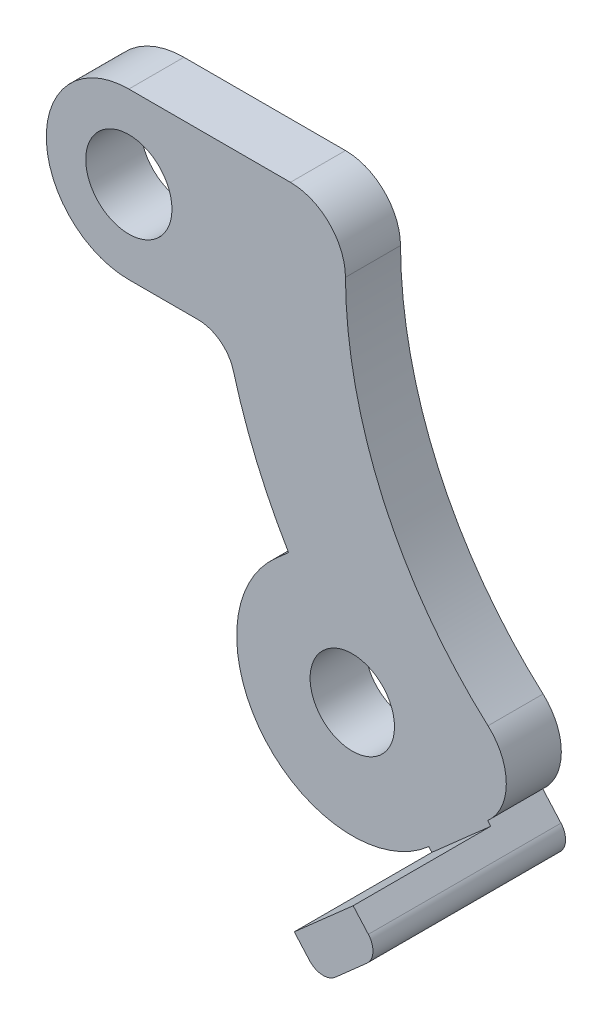
ISO-10303-21;
HEADER;
FILE_DESCRIPTION(('STEP AP214'),'2;1');
FILE_NAME('part.step','',(''),(''),'','','');
FILE_SCHEMA(('AUTOMOTIVE_DESIGN { 1 0 10303 214 1 1 1 1 }'));
ENDSEC;
DATA;
#1=APPLICATION_CONTEXT('core data for automotive mechanical design processes');
#2=APPLICATION_PROTOCOL_DEFINITION('international standard','automotive_design',2000,#1);
#3=PRODUCT_CONTEXT('',#1,'mechanical');
#4=PRODUCT('Part','Part','',(#3));
#5=PRODUCT_RELATED_PRODUCT_CATEGORY('part','',(#4));
#6=PRODUCT_DEFINITION_FORMATION('','',#4);
#7=PRODUCT_DEFINITION_CONTEXT('part definition',#1,'design');
#8=PRODUCT_DEFINITION('design','',#6,#7);
#9=PRODUCT_DEFINITION_SHAPE('','',#8);
#10=(LENGTH_UNIT() NAMED_UNIT(*) SI_UNIT(.MILLI.,.METRE.));
#11=(NAMED_UNIT(*) PLANE_ANGLE_UNIT() SI_UNIT($,.RADIAN.));
#12=(NAMED_UNIT(*) SI_UNIT($,.STERADIAN.) SOLID_ANGLE_UNIT());
#13=UNCERTAINTY_MEASURE_WITH_UNIT(LENGTH_MEASURE(1.E-05),#10,'distance_accuracy_value','');
#14=(GEOMETRIC_REPRESENTATION_CONTEXT(3) GLOBAL_UNCERTAINTY_ASSIGNED_CONTEXT((#13)) GLOBAL_UNIT_ASSIGNED_CONTEXT((#10,
#11,#12)) REPRESENTATION_CONTEXT('',''));
#15=CARTESIAN_POINT('',(0.,0.,0.));
#16=DIRECTION('',(0.,0.,1.));
#17=DIRECTION('',(1.,0.,0.));
#18=AXIS2_PLACEMENT_3D('',#15,#16,#17);
#19=CARTESIAN_POINT('',(0.,0.,-119.743878979662));
#20=DIRECTION('',(0.,0.,-1.));
#21=DIRECTION('',(-1.,0.,0.));
#22=AXIS2_PLACEMENT_3D('',#19,#20,#21);
#23=PLANE('',#22);
#24=DIRECTION('',(0.749329085481141,0.662197796471717,0.));
#25=VECTOR('',#24,1.);
#26=CARTESIAN_POINT('',(-7.19887593208548,27.9435845676672,-119.743878979662));
#27=LINE('',#26,#25);
#28=CARTESIAN_POINT('',(-7.19887593208549,27.9435845676672,-119.743878979662));
#29=VERTEX_POINT('',#28);
#30=CARTESIAN_POINT('',(-3.98934773701552,30.7799118098221,-119.743878979662));
#31=VERTEX_POINT('',#30);
#32=EDGE_CURVE('E171',#29,#31,#27,.T.);
#33=ORIENTED_EDGE('',*,*,#32,.F.);
#34=DIRECTION('',(0.662197796471717,-0.749329085481141,0.));
#35=VECTOR('',#34,1.);
#36=CARTESIAN_POINT('',(-5.70893089002412,26.2575941253346,-119.743878979662));
#37=LINE('',#36,#35);
#38=CARTESIAN_POINT('',(-6.37112868649584,27.0069232108158,-119.743878979662));
#39=VERTEX_POINT('',#38);
#40=EDGE_CURVE('E179',#29,#39,#37,.T.);
#41=ORIENTED_EDGE('',*,*,#40,.T.);
#42=CARTESIAN_POINT('',(-5.6217996010147,27.6691210072875,-119.743878979662));
#43=DIRECTION('',(0.,0.,-1.));
#44=DIRECTION('',(-1.,0.,0.));
#45=AXIS2_PLACEMENT_3D('',#42,#43,#44);
#46=CIRCLE('',#45,1.);
#47=CARTESIAN_POINT('',(-4.95960180454298,26.9197919218064,-119.743878979662));
#48=VERTEX_POINT('',#47);
#49=EDGE_CURVE('E47',#39,#48,#46,.F.);
#50=ORIENTED_EDGE('',*,*,#49,.T.);
#51=DIRECTION('',(0.749329085481141,0.662197796471717,0.));
#52=VECTOR('',#51,1.);
#53=CARTESIAN_POINT('',(-2.49940269495416,29.0939213674895,-119.743878979662));
#54=LINE('',#53,#52);
#55=CARTESIAN_POINT('',(-3.2487317804353,28.4317235710178,-119.743878979662));
#56=VERTEX_POINT('',#55);
#57=EDGE_CURVE('E184',#48,#56,#54,.T.);
#58=ORIENTED_EDGE('',*,*,#57,.T.);
#59=CARTESIAN_POINT('',(-3.91092957690702,29.181052656499,-119.743878979662));
#60=DIRECTION('',(0.,0.,-1.));
#61=DIRECTION('',(-1.,0.,0.));
#62=AXIS2_PLACEMENT_3D('',#59,#60,#61);
#63=CIRCLE('',#62,1.);
#64=CARTESIAN_POINT('',(-3.16160049142587,29.8432504529707,-119.743878979662));
#65=VERTEX_POINT('',#64);
#66=EDGE_CURVE('E62',#56,#65,#63,.F.);
#67=ORIENTED_EDGE('',*,*,#66,.T.);
#68=DIRECTION('',(-0.662197796471717,0.749329085481141,0.));
#69=VECTOR('',#68,1.);
#70=CARTESIAN_POINT('',(-4.15489718613345,30.9672440811924,-119.743878979662));
#71=LINE('',#70,#69);
#72=EDGE_CURVE('E186',#65,#31,#71,.T.);
#73=ORIENTED_EDGE('',*,*,#72,.T.);
#74=EDGE_LOOP('',(#33,#41,#50,#58,#67,#73));
#75=FACE_BOUND('',#74,.T.);
#76=ADVANCED_FACE('F39',(#75),#23,.F.);
#77=CARTESIAN_POINT('',(-19.9422261752407,44.7189600164803,-127.243878979662));
#78=DIRECTION('',(0.,0.,-1.));
#79=DIRECTION('',(-1.,0.,0.));
#80=AXIS2_PLACEMENT_3D('',#77,#78,#79);
#81=CYLINDRICAL_SURFACE('',#80,2.);
#82=CARTESIAN_POINT('',(-19.9422261752407,44.7189600164803,-130.243878979662));
#83=DIRECTION('',(0.,0.,1.));
#84=DIRECTION('',(1.,0.,0.));
#85=AXIS2_PLACEMENT_3D('',#82,#83,#84);
#86=CIRCLE('',#85,2.);
#87=CARTESIAN_POINT('',(-19.9422261752407,46.7189600164803,-130.243878979662));
#88=VERTEX_POINT('',#87);
#89=CARTESIAN_POINT('',(-18.0136160189661,45.2485477541048,-130.243878979662));
#90=VERTEX_POINT('',#89);
#91=EDGE_CURVE('E195',#88,#90,#86,.F.);
#92=ORIENTED_EDGE('',*,*,#91,.T.);
#93=DIRECTION('',(0.,0.,-1.));
#94=VECTOR('',#93,1.);
#95=CARTESIAN_POINT('',(-18.0136160189661,45.2485477541048,-127.243878979662));
#96=LINE('',#95,#94);
#97=CARTESIAN_POINT('',(-18.0136160189661,45.2485477541048,-127.243878979662));
#98=VERTEX_POINT('',#97);
#99=EDGE_CURVE('E280',#98,#90,#96,.T.);
#100=ORIENTED_EDGE('',*,*,#99,.F.);
#101=CARTESIAN_POINT('',(-19.9422261752407,44.7189600164803,-127.243878979662));
#102=DIRECTION('',(0.,0.,1.));
#103=DIRECTION('',(1.,0.,0.));
#104=AXIS2_PLACEMENT_3D('',#101,#102,#103);
#105=CIRCLE('',#104,2.);
#106=CARTESIAN_POINT('',(-19.9422261752407,46.7189600164803,-127.243878979662));
#107=VERTEX_POINT('',#106);
#108=EDGE_CURVE('E196',#107,#98,#105,.F.);
#109=ORIENTED_EDGE('',*,*,#108,.F.);
#110=DIRECTION('',(0.,0.,-1.));
#111=VECTOR('',#110,1.);
#112=CARTESIAN_POINT('',(-19.9422261752407,46.7189600164803,-127.243878979662));
#113=LINE('',#112,#111);
#114=EDGE_CURVE('E226',#107,#88,#113,.T.);
#115=ORIENTED_EDGE('',*,*,#114,.T.);
#116=EDGE_LOOP('',(#92,#100,#109,#115));
#117=FACE_BOUND('',#116,.T.);
#118=ADVANCED_FACE('F331',(#117),#81,.F.);
#119=CARTESIAN_POINT('',(9.61372850102481,52.8348932025687,-127.243878979662));
#120=DIRECTION('',(0.,0.,-1.));
#121=DIRECTION('',(-1.,0.,0.));
#122=AXIS2_PLACEMENT_3D('',#119,#120,#121);
#123=CYLINDRICAL_SURFACE('',#122,28.6500052117645);
#124=CARTESIAN_POINT('',(9.61372850102481,52.8348932025687,-130.243878979662));
#125=DIRECTION('',(0.,0.,1.));
#126=DIRECTION('',(1.,0.,0.));
#127=AXIS2_PLACEMENT_3D('',#124,#125,#126);
#128=CIRCLE('',#127,28.6500052117645);
#129=CARTESIAN_POINT('',(-15.0100594881716,38.189351894841,-130.243878979662));
#130=VERTEX_POINT('',#129);
#131=EDGE_CURVE('E229',#90,#130,#128,.T.);
#132=ORIENTED_EDGE('',*,*,#131,.T.);
#133=DIRECTION('',(0.,0.,-1.));
#134=VECTOR('',#133,1.);
#135=CARTESIAN_POINT('',(-15.0100594881716,38.189351894841,-127.243878979662));
#136=LINE('',#135,#134);
#137=CARTESIAN_POINT('',(-15.0100594881716,38.189351894841,-127.243878979662));
#138=VERTEX_POINT('',#137);
#139=EDGE_CURVE('E277',#138,#130,#136,.T.);
#140=ORIENTED_EDGE('',*,*,#139,.F.);
#141=CARTESIAN_POINT('',(9.61372850102481,52.8348932025687,-127.243878979662));
#142=DIRECTION('',(0.,0.,1.));
#143=DIRECTION('',(1.,0.,0.));
#144=AXIS2_PLACEMENT_3D('',#141,#142,#143);
#145=CIRCLE('',#144,28.6500052117645);
#146=EDGE_CURVE('E199',#98,#138,#145,.T.);
#147=ORIENTED_EDGE('',*,*,#146,.F.);
#148=ORIENTED_EDGE('',*,*,#99,.T.);
#149=EDGE_LOOP('',(#132,#140,#147,#148));
#150=FACE_BOUND('',#149,.T.);
#151=ADVANCED_FACE('F328',(#150),#123,.T.);
#152=CARTESIAN_POINT('',(-25.5317117816848,28.8911475424345,-127.243878979662));
#153=DIRECTION('',(0.662197796471688,-0.749329085481166,0.));
#154=DIRECTION('',(0.749329085481166,0.662197796471688,0.));
#155=AXIS2_PLACEMENT_3D('',#152,#153,#154);
#156=PLANE('',#155);
#157=DIRECTION('',(-0.749329085481166,-0.662197796471688,0.));
#158=VECTOR('',#157,1.);
#159=CARTESIAN_POINT('',(-25.5317117816848,28.8911475424345,-130.243878979662));
#160=LINE('',#159,#158);
#161=CARTESIAN_POINT('',(-15.7081176167469,37.5724633161,-130.243878979662));
#162=VERTEX_POINT('',#161);
#163=EDGE_CURVE('E231',#130,#162,#160,.T.);
#164=ORIENTED_EDGE('',*,*,#163,.T.);
#165=DIRECTION('',(0.,0.,-1.));
#166=VECTOR('',#165,1.);
#167=CARTESIAN_POINT('',(-15.7081176167469,37.5724633161,-127.243878979662));
#168=LINE('',#167,#166);
#169=CARTESIAN_POINT('',(-15.7081176167469,37.5724633161,-127.243878979662));
#170=VERTEX_POINT('',#169);
#171=EDGE_CURVE('E274',#170,#162,#168,.T.);
#172=ORIENTED_EDGE('',*,*,#171,.F.);
#173=DIRECTION('',(-0.749329085481166,-0.662197796471688,0.));
#174=VECTOR('',#173,1.);
#175=CARTESIAN_POINT('',(-25.5317117816848,28.8911475424345,-127.243878979662));
#176=LINE('',#175,#174);
#177=EDGE_CURVE('E202',#138,#170,#176,.T.);
#178=ORIENTED_EDGE('',*,*,#177,.F.);
#179=ORIENTED_EDGE('',*,*,#139,.T.);
#180=EDGE_LOOP('',(#164,#172,#178,#179));
#181=FACE_BOUND('',#180,.T.);
#182=ADVANCED_FACE('F322',(#181),#156,.F.);
#183=CARTESIAN_POINT('',(-11.5362714989752,32.8516900775687,-127.243878979662));
#184=DIRECTION('',(0.,0.,-1.));
#185=DIRECTION('',(-1.,0.,0.));
#186=AXIS2_PLACEMENT_3D('',#183,#184,#185);
#187=CYLINDRICAL_SURFACE('',#186,6.30000000000002);
#188=CARTESIAN_POINT('',(-11.5362714989752,32.8516900775687,-130.243878979662));
#189=DIRECTION('',(0.,0.,1.));
#190=DIRECTION('',(1.,0.,0.));
#191=AXIS2_PLACEMENT_3D('',#188,#189,#190);
#192=CIRCLE('',#191,6.30000000000002);
#193=CARTESIAN_POINT('',(-7.36442538120341,28.1309168390375,-130.243878979662));
#194=VERTEX_POINT('',#193);
#195=EDGE_CURVE('E233',#162,#194,#192,.T.);
#196=ORIENTED_EDGE('',*,*,#195,.T.);
#197=DIRECTION('',(0.,0.,-1.));
#198=VECTOR('',#197,1.);
#199=CARTESIAN_POINT('',(-7.36442538120341,28.1309168390375,-127.243878979662));
#200=LINE('',#199,#198);
#201=CARTESIAN_POINT('',(-7.36442538120341,28.1309168390375,-127.243878979662));
#202=VERTEX_POINT('',#201);
#203=EDGE_CURVE('E271',#202,#194,#200,.T.);
#204=ORIENTED_EDGE('',*,*,#203,.F.);
#205=CARTESIAN_POINT('',(-11.5362714989752,32.8516900775687,-127.243878979662));
#206=DIRECTION('',(0.,0.,1.));
#207=DIRECTION('',(1.,0.,0.));
#208=AXIS2_PLACEMENT_3D('',#205,#206,#207);
#209=CIRCLE('',#208,6.30000000000002);
#210=EDGE_CURVE('E204',#170,#202,#209,.T.);
#211=ORIENTED_EDGE('',*,*,#210,.F.);
#212=ORIENTED_EDGE('',*,*,#171,.T.);
#213=EDGE_LOOP('',(#196,#204,#211,#212));
#214=FACE_BOUND('',#213,.T.);
#215=ADVANCED_FACE('F317',(#214),#187,.T.);
#216=CARTESIAN_POINT('',(-6.14149057554769,33.2152313376348,-127.243878979662));
#217=DIRECTION('',(0.,0.,-1.));
#218=DIRECTION('',(-1.,0.,0.));
#219=AXIS2_PLACEMENT_3D('',#216,#217,#218);
#220=CYLINDRICAL_SURFACE('',#219,3.);
#221=CARTESIAN_POINT('',(-6.14149057554769,33.2152313376348,-130.243878979662));
#222=DIRECTION('',(0.,0.,1.));
#223=DIRECTION('',(1.,0.,0.));
#224=AXIS2_PLACEMENT_3D('',#221,#222,#223);
#225=CIRCLE('',#224,3.);
#226=CARTESIAN_POINT('',(-4.13884807824677,35.4489329802013,-130.243878979662));
#227=VERTEX_POINT('',#226);
#228=CARTESIAN_POINT('',(-4.15489718613345,30.9672440811924,-130.243878979662));
#229=VERTEX_POINT('',#228);
#230=EDGE_CURVE('E236',#227,#229,#225,.F.);
#231=ORIENTED_EDGE('',*,*,#230,.F.);
#232=DIRECTION('',(0.,0.,-1.));
#233=VECTOR('',#232,1.);
#234=CARTESIAN_POINT('',(-4.13884807824677,35.4489329802013,-127.243878979662));
#235=LINE('',#234,#233);
#236=CARTESIAN_POINT('',(-4.13884807824677,35.4489329802013,-127.243878979662));
#237=VERTEX_POINT('',#236);
#238=EDGE_CURVE('E268',#237,#227,#235,.T.);
#239=ORIENTED_EDGE('',*,*,#238,.F.);
#240=CARTESIAN_POINT('',(-6.14149057554769,33.2152313376348,-127.243878979662));
#241=DIRECTION('',(0.,0.,1.));
#242=DIRECTION('',(1.,0.,0.));
#243=AXIS2_PLACEMENT_3D('',#240,#241,#242);
#244=CIRCLE('',#243,3.);
#245=CARTESIAN_POINT('',(-4.15489718613345,30.9672440811924,-127.243878979662));
#246=VERTEX_POINT('',#245);
#247=EDGE_CURVE('E206',#237,#246,#244,.F.);
#248=ORIENTED_EDGE('',*,*,#247,.T.);
#249=DIRECTION('',(0.,0.,-1.));
#250=VECTOR('',#249,1.);
#251=CARTESIAN_POINT('',(-4.15489718613345,30.9672440811924,-127.243878979662));
#252=LINE('',#251,#250);
#253=EDGE_CURVE('E177',#246,#229,#252,.T.);
#254=ORIENTED_EDGE('',*,*,#253,.T.);
#255=EDGE_LOOP('',(#231,#239,#248,#254));
#256=FACE_BOUND('',#255,.T.);
#257=ADVANCED_FACE('F355',(#256),#220,.T.);
#258=CARTESIAN_POINT('',(11.4637285010269,52.8516900775688,-127.243878979662));
#259=DIRECTION('',(0.,0.,-1.));
#260=DIRECTION('',(-1.,0.,0.));
#261=AXIS2_PLACEMENT_3D('',#258,#259,#260);
#262=CYLINDRICAL_SURFACE('',#261,23.3729833462071);
#263=CARTESIAN_POINT('',(11.4637285010269,52.8516900775688,-130.243878979662));
#264=DIRECTION('',(0.,0.,1.));
#265=DIRECTION('',(1.,0.,0.));
#266=AXIS2_PLACEMENT_3D('',#263,#264,#265);
#267=CIRCLE('',#266,23.3729833462071);
#268=CARTESIAN_POINT('',(-11.908958834779,52.7340584290504,-130.243878979662));
#269=VERTEX_POINT('',#268);
#270=EDGE_CURVE('E239',#269,#227,#267,.T.);
#271=ORIENTED_EDGE('',*,*,#270,.F.);
#272=DIRECTION('',(0.,0.,-1.));
#273=VECTOR('',#272,1.);
#274=CARTESIAN_POINT('',(-11.908958834779,52.7340584290504,-127.243878979662));
#275=LINE('',#274,#273);
#276=CARTESIAN_POINT('',(-11.908958834779,52.7340584290504,-127.243878979662));
#277=VERTEX_POINT('',#276);
#278=EDGE_CURVE('E266',#277,#269,#275,.T.);
#279=ORIENTED_EDGE('',*,*,#278,.F.);
#280=CARTESIAN_POINT('',(11.4637285010269,52.8516900775688,-127.243878979662));
#281=DIRECTION('',(0.,0.,1.));
#282=DIRECTION('',(1.,0.,0.));
#283=AXIS2_PLACEMENT_3D('',#280,#281,#282);
#284=CIRCLE('',#283,23.3729833462071);
#285=EDGE_CURVE('E208',#277,#237,#284,.T.);
#286=ORIENTED_EDGE('',*,*,#285,.T.);
#287=ORIENTED_EDGE('',*,*,#238,.T.);
#288=EDGE_LOOP('',(#271,#279,#286,#287));
#289=FACE_BOUND('',#288,.T.);
#290=ADVANCED_FACE('F351',(#289),#262,.F.);
#291=CARTESIAN_POINT('',(-14.9089208408614,52.7189600164802,-127.243878979662));
#292=DIRECTION('',(0.,0.,-1.));
#293=DIRECTION('',(-1.,0.,0.));
#294=AXIS2_PLACEMENT_3D('',#291,#292,#293);
#295=CYLINDRICAL_SURFACE('',#294,3.);
#296=CARTESIAN_POINT('',(-14.9089208408614,52.7189600164802,-130.243878979662));
#297=DIRECTION('',(0.,0.,1.));
#298=DIRECTION('',(1.,0.,0.));
#299=AXIS2_PLACEMENT_3D('',#296,#297,#298);
#300=CIRCLE('',#299,3.);
#301=CARTESIAN_POINT('',(-14.9089208408614,55.7189600164802,-130.243878979662));
#302=VERTEX_POINT('',#301);
#303=EDGE_CURVE('E242',#269,#302,#300,.T.);
#304=ORIENTED_EDGE('',*,*,#303,.T.);
#305=DIRECTION('',(0.,0.,-1.));
#306=VECTOR('',#305,1.);
#307=CARTESIAN_POINT('',(-14.9089208408614,55.7189600164802,-127.243878979662));
#308=LINE('',#307,#306);
#309=CARTESIAN_POINT('',(-14.9089208408614,55.7189600164802,-127.243878979662));
#310=VERTEX_POINT('',#309);
#311=EDGE_CURVE('E264',#310,#302,#308,.T.);
#312=ORIENTED_EDGE('',*,*,#311,.F.);
#313=CARTESIAN_POINT('',(-14.9089208408614,52.7189600164802,-127.243878979662));
#314=DIRECTION('',(0.,0.,1.));
#315=DIRECTION('',(1.,0.,0.));
#316=AXIS2_PLACEMENT_3D('',#313,#314,#315);
#317=CIRCLE('',#316,3.);
#318=EDGE_CURVE('E211',#277,#310,#317,.T.);
#319=ORIENTED_EDGE('',*,*,#318,.F.);
#320=ORIENTED_EDGE('',*,*,#278,.T.);
#321=EDGE_LOOP('',(#304,#312,#319,#320));
#322=FACE_BOUND('',#321,.T.);
#323=ADVANCED_FACE('F348',(#322),#295,.T.);
#324=CARTESIAN_POINT('',(0.,55.7189600164802,-127.243878979662));
#325=DIRECTION('',(0.,1.,0.));
#326=DIRECTION('',(0.,0.,1.));
#327=AXIS2_PLACEMENT_3D('',#324,#325,#326);
#328=PLANE('',#327);
#329=DIRECTION('',(1.,0.,0.));
#330=VECTOR('',#329,1.);
#331=CARTESIAN_POINT('',(0.,55.7189600164802,-130.243878979662));
#332=LINE('',#331,#330);
#333=CARTESIAN_POINT('',(-23.7160538447542,55.7189600164802,-130.243878979662));
#334=VERTEX_POINT('',#333);
#335=EDGE_CURVE('E245',#334,#302,#332,.T.);
#336=ORIENTED_EDGE('',*,*,#335,.F.);
#337=DIRECTION('',(0.,0.,-1.));
#338=VECTOR('',#337,1.);
#339=CARTESIAN_POINT('',(-23.7160538447542,55.7189600164802,-127.243878979662));
#340=LINE('',#339,#338);
#341=CARTESIAN_POINT('',(-23.7160538447542,55.7189600164802,-127.243878979662));
#342=VERTEX_POINT('',#341);
#343=EDGE_CURVE('E262',#342,#334,#340,.T.);
#344=ORIENTED_EDGE('',*,*,#343,.F.);
#345=DIRECTION('',(1.,0.,0.));
#346=VECTOR('',#345,1.);
#347=CARTESIAN_POINT('',(0.,55.7189600164802,-127.243878979662));
#348=LINE('',#347,#346);
#349=EDGE_CURVE('E213',#342,#310,#348,.T.);
#350=ORIENTED_EDGE('',*,*,#349,.T.);
#351=ORIENTED_EDGE('',*,*,#311,.T.);
#352=EDGE_LOOP('',(#336,#344,#350,#351));
#353=FACE_BOUND('',#352,.T.);
#354=ADVANCED_FACE('F342',(#353),#328,.T.);
#355=CARTESIAN_POINT('',(-23.7160538447542,51.2189600164802,-127.243878979662));
#356=DIRECTION('',(0.,0.,-1.));
#357=DIRECTION('',(-1.,0.,0.));
#358=AXIS2_PLACEMENT_3D('',#355,#356,#357);
#359=CYLINDRICAL_SURFACE('',#358,4.5);
#360=CARTESIAN_POINT('',(-23.7160538447542,51.2189600164802,-130.243878979662));
#361=DIRECTION('',(0.,0.,1.));
#362=DIRECTION('',(1.,0.,0.));
#363=AXIS2_PLACEMENT_3D('',#360,#361,#362);
#364=CIRCLE('',#363,4.5);
#365=CARTESIAN_POINT('',(-23.7160538447542,46.7189600164802,-130.243878979662));
#366=VERTEX_POINT('',#365);
#367=EDGE_CURVE('E248',#334,#366,#364,.T.);
#368=ORIENTED_EDGE('',*,*,#367,.T.);
#369=DIRECTION('',(0.,0.,-1.));
#370=VECTOR('',#369,1.);
#371=CARTESIAN_POINT('',(-23.7160538447542,46.7189600164802,-127.243878979662));
#372=LINE('',#371,#370);
#373=CARTESIAN_POINT('',(-23.7160538447542,46.7189600164802,-127.243878979662));
#374=VERTEX_POINT('',#373);
#375=EDGE_CURVE('E259',#374,#366,#372,.T.);
#376=ORIENTED_EDGE('',*,*,#375,.F.);
#377=CARTESIAN_POINT('',(-23.7160538447542,51.2189600164802,-127.243878979662));
#378=DIRECTION('',(0.,0.,1.));
#379=DIRECTION('',(1.,0.,0.));
#380=AXIS2_PLACEMENT_3D('',#377,#378,#379);
#381=CIRCLE('',#380,4.5);
#382=EDGE_CURVE('E216',#342,#374,#381,.T.);
#383=ORIENTED_EDGE('',*,*,#382,.F.);
#384=ORIENTED_EDGE('',*,*,#343,.T.);
#385=EDGE_LOOP('',(#368,#376,#383,#384));
#386=FACE_BOUND('',#385,.T.);
#387=ADVANCED_FACE('F391',(#386),#359,.T.);
#388=CARTESIAN_POINT('',(-23.7160538447542,51.2189600164802,-127.243878979662));
#389=DIRECTION('',(0.,0.,-1.));
#390=DIRECTION('',(-1.,0.,0.));
#391=AXIS2_PLACEMENT_3D('',#388,#389,#390);
#392=CYLINDRICAL_SURFACE('',#391,2.35);
#393=CARTESIAN_POINT('',(-23.7160538447542,51.2189600164802,-127.243878979662));
#394=DIRECTION('',(0.,0.,1.));
#395=DIRECTION('',(1.,0.,0.));
#396=AXIS2_PLACEMENT_3D('',#393,#394,#395);
#397=CIRCLE('',#396,2.35);
#398=CARTESIAN_POINT('',(-21.3660538447542,51.2189600164802,-127.243878979662));
#399=VERTEX_POINT('',#398);
#400=EDGE_CURVE('E220',#399,#399,#397,.T.);
#401=ORIENTED_EDGE('',*,*,#400,.T.);
#402=EDGE_LOOP('',(#401));
#403=FACE_BOUND('',#402,.T.);
#404=CARTESIAN_POINT('',(-23.7160538447542,51.2189600164802,-130.243878979662));
#405=DIRECTION('',(0.,0.,1.));
#406=DIRECTION('',(1.,0.,0.));
#407=AXIS2_PLACEMENT_3D('',#404,#405,#406);
#408=CIRCLE('',#407,2.35);
#409=CARTESIAN_POINT('',(-21.3660538447542,51.2189600164802,-130.243878979662));
#410=VERTEX_POINT('',#409);
#411=EDGE_CURVE('E252',#410,#410,#408,.T.);
#412=ORIENTED_EDGE('',*,*,#411,.F.);
#413=EDGE_LOOP('',(#412));
#414=FACE_BOUND('',#413,.T.);
#415=ADVANCED_FACE('F388',(#403,#414),#392,.F.);
#416=CARTESIAN_POINT('',(0.,46.7189600164803,-127.243878979662));
#417=DIRECTION('',(0.,1.,0.));
#418=DIRECTION('',(-1.,0.,0.));
#419=AXIS2_PLACEMENT_3D('',#416,#417,#418);
#420=PLANE('',#419);
#421=DIRECTION('',(1.,0.,0.));
#422=VECTOR('',#421,1.);
#423=CARTESIAN_POINT('',(0.,46.7189600164803,-130.243878979662));
#424=LINE('',#423,#422);
#425=EDGE_CURVE('E250',#366,#88,#424,.T.);
#426=ORIENTED_EDGE('',*,*,#425,.T.);
#427=ORIENTED_EDGE('',*,*,#114,.F.);
#428=DIRECTION('',(1.,0.,0.));
#429=VECTOR('',#428,1.);
#430=CARTESIAN_POINT('',(0.,46.7189600164803,-127.243878979662));
#431=LINE('',#430,#429);
#432=EDGE_CURVE('E218',#374,#107,#431,.T.);
#433=ORIENTED_EDGE('',*,*,#432,.F.);
#434=ORIENTED_EDGE('',*,*,#375,.T.);
#435=EDGE_LOOP('',(#426,#427,#433,#434));
#436=FACE_BOUND('',#435,.T.);
#437=ADVANCED_FACE('F335',(#436),#420,.F.);
#438=CARTESIAN_POINT('',(-11.5362714989739,32.8516900775688,-127.243878979662));
#439=DIRECTION('',(0.,0.,-1.));
#440=DIRECTION('',(-1.,0.,0.));
#441=AXIS2_PLACEMENT_3D('',#438,#439,#440);
#442=CYLINDRICAL_SURFACE('',#441,2.3);
#443=CARTESIAN_POINT('',(-11.5362714989739,32.8516900775688,-127.243878979662));
#444=DIRECTION('',(0.,0.,1.));
#445=DIRECTION('',(1.,0.,0.));
#446=AXIS2_PLACEMENT_3D('',#443,#444,#445);
#447=CIRCLE('',#446,2.3);
#448=CARTESIAN_POINT('',(-9.23627149897394,32.8516900775688,-127.243878979662));
#449=VERTEX_POINT('',#448);
#450=EDGE_CURVE('E223',#449,#449,#447,.T.);
#451=ORIENTED_EDGE('',*,*,#450,.T.);
#452=EDGE_LOOP('',(#451));
#453=FACE_BOUND('',#452,.T.);
#454=CARTESIAN_POINT('',(-11.5362714989739,32.8516900775688,-130.243878979662));
#455=DIRECTION('',(0.,0.,1.));
#456=DIRECTION('',(1.,0.,0.));
#457=AXIS2_PLACEMENT_3D('',#454,#455,#456);
#458=CIRCLE('',#457,2.3);
#459=CARTESIAN_POINT('',(-9.23627149897394,32.8516900775688,-130.243878979662));
#460=VERTEX_POINT('',#459);
#461=EDGE_CURVE('E200',#460,#460,#458,.T.);
#462=ORIENTED_EDGE('',*,*,#461,.F.);
#463=EDGE_LOOP('',(#462));
#464=FACE_BOUND('',#463,.T.);
#465=ADVANCED_FACE('F382',(#453,#464),#442,.F.);
#466=CARTESIAN_POINT('',(0.,0.,-127.243878979662));
#467=DIRECTION('',(0.,0.,1.));
#468=DIRECTION('',(1.,0.,0.));
#469=AXIS2_PLACEMENT_3D('',#466,#467,#468);
#470=PLANE('',#469);
#471=ORIENTED_EDGE('',*,*,#210,.T.);
#472=DIRECTION('',(-0.662197796471717,0.749329085481141,0.));
#473=VECTOR('',#472,1.);
#474=CARTESIAN_POINT('',(-7.19887593208548,27.9435845676672,-127.243878979662));
#475=LINE('',#474,#473);
#476=CARTESIAN_POINT('',(-7.19887593208548,27.9435845676672,-127.243878979662));
#477=VERTEX_POINT('',#476);
#478=EDGE_CURVE('E166',#477,#202,#475,.T.);
#479=ORIENTED_EDGE('',*,*,#478,.F.);
#480=DIRECTION('',(-0.749329085481141,-0.662197796471717,0.));
#481=VECTOR('',#480,1.);
#482=CARTESIAN_POINT('',(-3.98934773701552,30.7799118098221,-127.243878979662));
#483=LINE('',#482,#481);
#484=CARTESIAN_POINT('',(-3.98934773701552,30.7799118098221,-127.243878979662));
#485=VERTEX_POINT('',#484);
#486=EDGE_CURVE('E157',#485,#477,#483,.T.);
#487=ORIENTED_EDGE('',*,*,#486,.F.);
#488=DIRECTION('',(-0.662197796471717,0.749329085481141,0.));
#489=VECTOR('',#488,1.);
#490=CARTESIAN_POINT('',(-3.98934773701552,30.7799118098221,-127.243878979662));
#491=LINE('',#490,#489);
#492=EDGE_CURVE('E164',#485,#246,#491,.T.);
#493=ORIENTED_EDGE('',*,*,#492,.T.);
#494=ORIENTED_EDGE('',*,*,#247,.F.);
#495=ORIENTED_EDGE('',*,*,#285,.F.);
#496=ORIENTED_EDGE('',*,*,#318,.T.);
#497=ORIENTED_EDGE('',*,*,#349,.F.);
#498=ORIENTED_EDGE('',*,*,#382,.T.);
#499=ORIENTED_EDGE('',*,*,#432,.T.);
#500=ORIENTED_EDGE('',*,*,#108,.T.);
#501=ORIENTED_EDGE('',*,*,#146,.T.);
#502=ORIENTED_EDGE('',*,*,#177,.T.);
#503=EDGE_LOOP('',(#471,#479,#487,#493,#494,#495,#496,#497,#498,#499,#500,#501,#502));
#504=FACE_BOUND('',#503,.T.);
#505=ORIENTED_EDGE('',*,*,#400,.F.);
#506=EDGE_LOOP('',(#505));
#507=FACE_BOUND('',#506,.T.);
#508=ORIENTED_EDGE('',*,*,#450,.F.);
#509=EDGE_LOOP('',(#508));
#510=FACE_BOUND('',#509,.T.);
#511=ADVANCED_FACE('F160',(#504,#507,#510),#470,.T.);
#512=CARTESIAN_POINT('',(0.,0.,-130.243878979662));
#513=DIRECTION('',(0.,0.,1.));
#514=DIRECTION('',(1.,0.,0.));
#515=AXIS2_PLACEMENT_3D('',#512,#513,#514);
#516=PLANE('',#515);
#517=DIRECTION('',(0.749329085481141,0.662197796471717,0.));
#518=VECTOR('',#517,1.);
#519=CARTESIAN_POINT('',(-5.70893089002412,26.2575941253346,-130.243878979662));
#520=LINE('',#519,#518);
#521=CARTESIAN_POINT('',(-4.95960180454298,26.9197919218064,-130.243878979662));
#522=VERTEX_POINT('',#521);
#523=CARTESIAN_POINT('',(-3.2487317804353,28.4317235710178,-130.243878979662));
#524=VERTEX_POINT('',#523);
#525=EDGE_CURVE('E188',#522,#524,#520,.T.);
#526=ORIENTED_EDGE('',*,*,#525,.F.);
#527=CARTESIAN_POINT('',(-5.6217996010147,27.6691210072875,-130.243878979662));
#528=DIRECTION('',(0.,0.,1.));
#529=DIRECTION('',(1.,0.,0.));
#530=AXIS2_PLACEMENT_3D('',#527,#528,#529);
#531=CIRCLE('',#530,1.);
#532=CARTESIAN_POINT('',(-6.37112868649584,27.0069232108158,-130.243878979662));
#533=VERTEX_POINT('',#532);
#534=EDGE_CURVE('E291',#522,#533,#531,.F.);
#535=ORIENTED_EDGE('',*,*,#534,.T.);
#536=DIRECTION('',(-0.662197796471717,0.749329085481141,0.));
#537=VECTOR('',#536,1.);
#538=CARTESIAN_POINT('',(-5.70893089002412,26.2575941253346,-130.243878979662));
#539=LINE('',#538,#537);
#540=EDGE_CURVE('E193',#533,#194,#539,.T.);
#541=ORIENTED_EDGE('',*,*,#540,.T.);
#542=ORIENTED_EDGE('',*,*,#195,.F.);
#543=ORIENTED_EDGE('',*,*,#163,.F.);
#544=ORIENTED_EDGE('',*,*,#131,.F.);
#545=ORIENTED_EDGE('',*,*,#91,.F.);
#546=ORIENTED_EDGE('',*,*,#425,.F.);
#547=ORIENTED_EDGE('',*,*,#367,.F.);
#548=ORIENTED_EDGE('',*,*,#335,.T.);
#549=ORIENTED_EDGE('',*,*,#303,.F.);
#550=ORIENTED_EDGE('',*,*,#270,.T.);
#551=ORIENTED_EDGE('',*,*,#230,.T.);
#552=DIRECTION('',(-0.662197796471717,0.749329085481141,0.));
#553=VECTOR('',#552,1.);
#554=CARTESIAN_POINT('',(-2.49940269495416,29.0939213674895,-130.243878979662));
#555=LINE('',#554,#553);
#556=CARTESIAN_POINT('',(-3.16160049142588,29.8432504529707,-130.243878979662));
#557=VERTEX_POINT('',#556);
#558=EDGE_CURVE('E191',#557,#229,#555,.T.);
#559=ORIENTED_EDGE('',*,*,#558,.F.);
#560=CARTESIAN_POINT('',(-3.91092957690702,29.181052656499,-130.243878979662));
#561=DIRECTION('',(0.,0.,1.));
#562=DIRECTION('',(1.,0.,0.));
#563=AXIS2_PLACEMENT_3D('',#560,#561,#562);
#564=CIRCLE('',#563,1.);
#565=EDGE_CURVE('E289',#557,#524,#564,.F.);
#566=ORIENTED_EDGE('',*,*,#565,.T.);
#567=EDGE_LOOP('',(#526,#535,#541,#542,#543,#544,#545,#546,#547,#548,#549,#550,#551,#559,#566));
#568=FACE_BOUND('',#567,.T.);
#569=ORIENTED_EDGE('',*,*,#411,.T.);
#570=EDGE_LOOP('',(#569));
#571=FACE_BOUND('',#570,.T.);
#572=ORIENTED_EDGE('',*,*,#461,.T.);
#573=EDGE_LOOP('',(#572));
#574=FACE_BOUND('',#573,.T.);
#575=ADVANCED_FACE('F309',(#568,#571,#574),#516,.F.);
#576=CARTESIAN_POINT('',(-5.70893089002412,26.2575941253346,-127.243878979662));
#577=DIRECTION('',(0.749329085481141,0.662197796471717,0.));
#578=DIRECTION('',(-0.662197796471717,0.749329085481141,0.));
#579=AXIS2_PLACEMENT_3D('',#576,#577,#578);
#580=PLANE('',#579);
#581=DIRECTION('',(0.,0.,1.));
#582=VECTOR('',#581,1.);
#583=CARTESIAN_POINT('',(-7.19887593208548,27.9435845676672,-127.243878979662));
#584=LINE('',#583,#582);
#585=EDGE_CURVE('E54',#477,#29,#584,.T.);
#586=ORIENTED_EDGE('',*,*,#585,.F.);
#587=ORIENTED_EDGE('',*,*,#478,.T.);
#588=ORIENTED_EDGE('',*,*,#203,.T.);
#589=ORIENTED_EDGE('',*,*,#540,.F.);
#590=DIRECTION('',(0.,0.,-1.));
#591=VECTOR('',#590,1.);
#592=CARTESIAN_POINT('',(-6.37112868649584,27.0069232108158,-119.743878979662));
#593=LINE('',#592,#591);
#594=EDGE_CURVE('E293',#533,#39,#593,.F.);
#595=ORIENTED_EDGE('',*,*,#594,.T.);
#596=ORIENTED_EDGE('',*,*,#40,.F.);
#597=EDGE_LOOP('',(#586,#587,#588,#589,#595,#596));
#598=FACE_BOUND('',#597,.T.);
#599=ADVANCED_FACE('F313',(#598),#580,.F.);
#600=CARTESIAN_POINT('',(-2.49940269495416,29.0939213674895,-130.243878979662));
#601=DIRECTION('',(-0.749329085481141,-0.662197796471717,0.));
#602=DIRECTION('',(0.662197796471717,-0.749329085481141,0.));
#603=AXIS2_PLACEMENT_3D('',#600,#601,#602);
#604=PLANE('',#603);
#605=ORIENTED_EDGE('',*,*,#253,.F.);
#606=ORIENTED_EDGE('',*,*,#492,.F.);
#607=DIRECTION('',(0.,0.,-1.));
#608=VECTOR('',#607,1.);
#609=CARTESIAN_POINT('',(-3.98934773701552,30.7799118098221,-119.743878979662));
#610=LINE('',#609,#608);
#611=EDGE_CURVE('E167',#31,#485,#610,.T.);
#612=ORIENTED_EDGE('',*,*,#611,.F.);
#613=ORIENTED_EDGE('',*,*,#72,.F.);
#614=DIRECTION('',(0.,0.,1.));
#615=VECTOR('',#614,1.);
#616=CARTESIAN_POINT('',(-3.16160049142588,29.8432504529707,-130.243878979662));
#617=LINE('',#616,#615);
#618=EDGE_CURVE('E11',#65,#557,#617,.F.);
#619=ORIENTED_EDGE('',*,*,#618,.T.);
#620=ORIENTED_EDGE('',*,*,#558,.T.);
#621=EDGE_LOOP('',(#605,#606,#612,#613,#619,#620));
#622=FACE_BOUND('',#621,.T.);
#623=ADVANCED_FACE('F175',(#622),#604,.F.);
#624=CARTESIAN_POINT('',(-15.5325250549626,17.5762783516679,0.));
#625=DIRECTION('',(0.662197796471717,-0.749329085481141,0.));
#626=DIRECTION('',(0.749329085481141,0.662197796471717,0.));
#627=AXIS2_PLACEMENT_3D('',#624,#625,#626);
#628=PLANE('',#627);
#629=ORIENTED_EDGE('',*,*,#57,.F.);
#630=DIRECTION('',(0.,0.,-1.));
#631=VECTOR('',#630,1.);
#632=CARTESIAN_POINT('',(-4.95960180454298,26.9197919218064,-130.243878979662));
#633=LINE('',#632,#631);
#634=EDGE_CURVE('E286',#48,#522,#633,.T.);
#635=ORIENTED_EDGE('',*,*,#634,.T.);
#636=ORIENTED_EDGE('',*,*,#525,.T.);
#637=DIRECTION('',(0.,0.,1.));
#638=VECTOR('',#637,1.);
#639=CARTESIAN_POINT('',(-3.2487317804353,28.4317235710178,-119.743878979662));
#640=LINE('',#639,#638);
#641=EDGE_CURVE('E283',#524,#56,#640,.T.);
#642=ORIENTED_EDGE('',*,*,#641,.T.);
#643=EDGE_LOOP('',(#629,#635,#636,#642));
#644=FACE_BOUND('',#643,.T.);
#645=ADVANCED_FACE('F303',(#644),#628,.T.);
#646=CARTESIAN_POINT('',(-5.6217996010147,27.6691210072875,0.));
#647=DIRECTION('',(0.,0.,1.));
#648=DIRECTION('',(1.,0.,0.));
#649=AXIS2_PLACEMENT_3D('',#646,#647,#648);
#650=CYLINDRICAL_SURFACE('',#649,1.);
#651=ORIENTED_EDGE('',*,*,#49,.F.);
#652=ORIENTED_EDGE('',*,*,#594,.F.);
#653=ORIENTED_EDGE('',*,*,#534,.F.);
#654=ORIENTED_EDGE('',*,*,#634,.F.);
#655=EDGE_LOOP('',(#651,#652,#653,#654));
#656=FACE_BOUND('',#655,.T.);
#657=ADVANCED_FACE('F306',(#656),#650,.T.);
#658=CARTESIAN_POINT('',(-3.91092957690702,29.181052656499,0.));
#659=DIRECTION('',(0.,0.,-1.));
#660=DIRECTION('',(-1.,0.,0.));
#661=AXIS2_PLACEMENT_3D('',#658,#659,#660);
#662=CYLINDRICAL_SURFACE('',#661,1.);
#663=ORIENTED_EDGE('',*,*,#565,.F.);
#664=ORIENTED_EDGE('',*,*,#618,.F.);
#665=ORIENTED_EDGE('',*,*,#66,.F.);
#666=ORIENTED_EDGE('',*,*,#641,.F.);
#667=EDGE_LOOP('',(#663,#664,#665,#666));
#668=FACE_BOUND('',#667,.T.);
#669=ADVANCED_FACE('F41',(#668),#662,.T.);
#670=CARTESIAN_POINT('',(-17.022470097024,19.2622687940005,0.));
#671=DIRECTION('',(-0.662197796471717,0.749329085481141,0.));
#672=DIRECTION('',(-0.749329085481141,-0.662197796471717,0.));
#673=AXIS2_PLACEMENT_3D('',#670,#671,#672);
#674=PLANE('',#673);
#675=ORIENTED_EDGE('',*,*,#611,.T.);
#676=ORIENTED_EDGE('',*,*,#486,.T.);
#677=ORIENTED_EDGE('',*,*,#585,.T.);
#678=ORIENTED_EDGE('',*,*,#32,.T.);
#679=EDGE_LOOP('',(#675,#676,#677,#678));
#680=FACE_BOUND('',#679,.T.);
#681=ADVANCED_FACE('F170',(#680),#674,.T.);
#682=CLOSED_SHELL('',(#76,#118,#151,#182,#215,#257,#290,#323,#354,#387,#415,#437,#465,#511,#575,
#599,#623,#645,#657,#669,#681));
#683=MANIFOLD_SOLID_BREP('B2',#682);
#684=ADVANCED_BREP_SHAPE_REPRESENTATION('',(#18,#683),#14);
#685=SHAPE_DEFINITION_REPRESENTATION(#9,#684);
ENDSEC;
END-ISO-10303-21;
